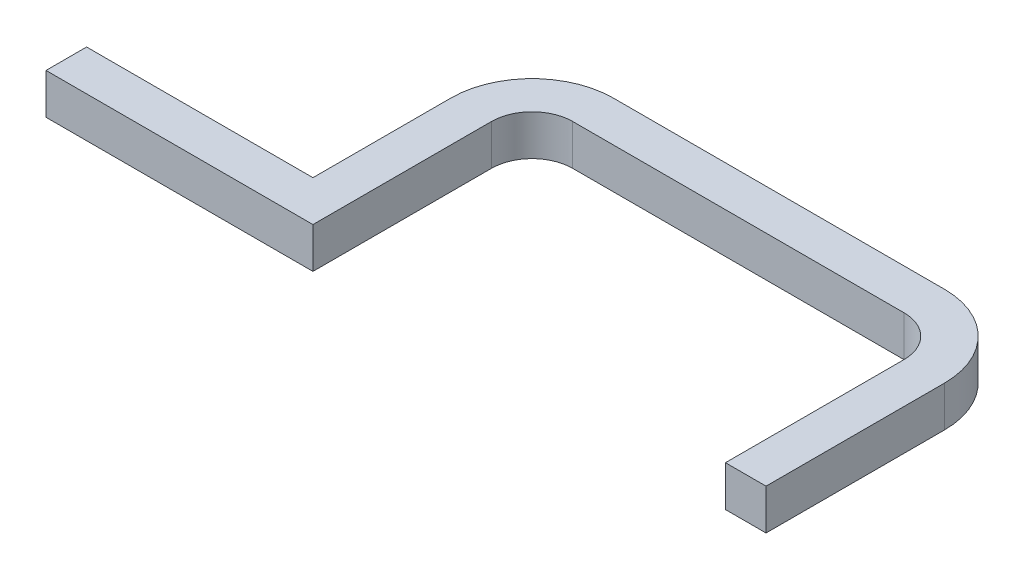
ISO-10303-21;
HEADER;
FILE_DESCRIPTION(('STEP AP214'),'2;1');
FILE_NAME('part.step','',(''),(''),'','','');
FILE_SCHEMA(('AUTOMOTIVE_DESIGN { 1 0 10303 214 1 1 1 1 }'));
ENDSEC;
DATA;
#1=APPLICATION_CONTEXT('core data for automotive mechanical design processes');
#2=APPLICATION_PROTOCOL_DEFINITION('international standard','automotive_design',2000,#1);
#3=PRODUCT_CONTEXT('',#1,'mechanical');
#4=PRODUCT('Part','Part','',(#3));
#5=PRODUCT_RELATED_PRODUCT_CATEGORY('part','',(#4));
#6=PRODUCT_DEFINITION_FORMATION('','',#4);
#7=PRODUCT_DEFINITION_CONTEXT('part definition',#1,'design');
#8=PRODUCT_DEFINITION('design','',#6,#7);
#9=PRODUCT_DEFINITION_SHAPE('','',#8);
#10=(LENGTH_UNIT() NAMED_UNIT(*) SI_UNIT(.MILLI.,.METRE.));
#11=(NAMED_UNIT(*) PLANE_ANGLE_UNIT() SI_UNIT($,.RADIAN.));
#12=(NAMED_UNIT(*) SI_UNIT($,.STERADIAN.) SOLID_ANGLE_UNIT());
#13=UNCERTAINTY_MEASURE_WITH_UNIT(LENGTH_MEASURE(1.E-05),#10,'distance_accuracy_value','');
#14=(GEOMETRIC_REPRESENTATION_CONTEXT(3) GLOBAL_UNCERTAINTY_ASSIGNED_CONTEXT((#13)) GLOBAL_UNIT_ASSIGNED_CONTEXT((#10,
#11,#12)) REPRESENTATION_CONTEXT('',''));
#15=CARTESIAN_POINT('',(0.,0.,0.));
#16=DIRECTION('',(0.,0.,1.));
#17=DIRECTION('',(1.,0.,0.));
#18=AXIS2_PLACEMENT_3D('',#15,#16,#17);
#19=CARTESIAN_POINT('',(0.,10.,0.));
#20=DIRECTION('',(0.,0.,-1.));
#21=DIRECTION('',(-1.,0.,0.));
#22=AXIS2_PLACEMENT_3D('',#19,#20,#21);
#23=PLANE('',#22);
#24=DIRECTION('',(1.,0.,0.));
#25=VECTOR('',#24,1.);
#26=CARTESIAN_POINT('',(0.,0.,0.));
#27=LINE('',#26,#25);
#28=CARTESIAN_POINT('',(-36.6007252870548,0.,0.));
#29=VERTEX_POINT('',#28);
#30=CARTESIAN_POINT('',(29.1495515678732,0.,0.));
#31=VERTEX_POINT('',#30);
#32=EDGE_CURVE('E101',#29,#31,#27,.T.);
#33=ORIENTED_EDGE('',*,*,#32,.T.);
#34=DIRECTION('',(0.,-1.,0.));
#35=VECTOR('',#34,1.);
#36=CARTESIAN_POINT('',(29.1495515678732,10.,0.));
#37=LINE('',#36,#35);
#38=CARTESIAN_POINT('',(29.1495515678732,10.,0.));
#39=VERTEX_POINT('',#38);
#40=EDGE_CURVE('E11',#39,#31,#37,.T.);
#41=ORIENTED_EDGE('',*,*,#40,.F.);
#42=DIRECTION('',(1.,0.,0.));
#43=VECTOR('',#42,1.);
#44=CARTESIAN_POINT('',(-36.6007252870548,10.,0.));
#45=LINE('',#44,#43);
#46=CARTESIAN_POINT('',(-36.6007252870548,10.,0.));
#47=VERTEX_POINT('',#46);
#48=EDGE_CURVE('E107',#47,#39,#45,.T.);
#49=ORIENTED_EDGE('',*,*,#48,.F.);
#50=DIRECTION('',(0.,-1.,0.));
#51=VECTOR('',#50,1.);
#52=CARTESIAN_POINT('',(-36.6007252870548,10.,0.));
#53=LINE('',#52,#51);
#54=EDGE_CURVE('E160',#47,#29,#53,.T.);
#55=ORIENTED_EDGE('',*,*,#54,.T.);
#56=EDGE_LOOP('',(#33,#41,#49,#55));
#57=FACE_BOUND('',#56,.T.);
#58=ADVANCED_FACE('F32',(#57),#23,.F.);
#59=CARTESIAN_POINT('',(29.1495515678732,10.,0.));
#60=DIRECTION('',(-1.,0.,0.));
#61=DIRECTION('',(0.,0.,1.));
#62=AXIS2_PLACEMENT_3D('',#59,#60,#61);
#63=PLANE('',#62);
#64=DIRECTION('',(0.,0.,-1.));
#65=VECTOR('',#64,1.);
#66=CARTESIAN_POINT('',(29.1495515678732,0.,0.));
#67=LINE('',#66,#65);
#68=CARTESIAN_POINT('',(29.1495515678732,0.,-43.9749999999999));
#69=VERTEX_POINT('',#68);
#70=EDGE_CURVE('E165',#31,#69,#67,.T.);
#71=ORIENTED_EDGE('',*,*,#70,.T.);
#72=DIRECTION('',(0.,-1.,0.));
#73=VECTOR('',#72,1.);
#74=CARTESIAN_POINT('',(29.1495515678732,10.,-43.9749999999999));
#75=LINE('',#74,#73);
#76=CARTESIAN_POINT('',(29.1495515678732,10.,-43.9749999999999));
#77=VERTEX_POINT('',#76);
#78=EDGE_CURVE('E40',#77,#69,#75,.T.);
#79=ORIENTED_EDGE('',*,*,#78,.F.);
#80=DIRECTION('',(0.,0.,-1.));
#81=VECTOR('',#80,1.);
#82=CARTESIAN_POINT('',(29.1495515678732,10.,0.));
#83=LINE('',#82,#81);
#84=EDGE_CURVE('E267',#39,#77,#83,.T.);
#85=ORIENTED_EDGE('',*,*,#84,.F.);
#86=ORIENTED_EDGE('',*,*,#40,.T.);
#87=EDGE_LOOP('',(#71,#79,#85,#86));
#88=FACE_BOUND('',#87,.T.);
#89=ADVANCED_FACE('F270',(#88),#63,.F.);
#90=CARTESIAN_POINT('',(39.1495515678732,10.,-43.975));
#91=DIRECTION('',(0.,-1.,0.));
#92=DIRECTION('',(0.,0.,-1.));
#93=AXIS2_PLACEMENT_3D('',#90,#91,#92);
#94=CYLINDRICAL_SURFACE('',#93,10.);
#95=CARTESIAN_POINT('',(39.1495515678732,0.,-43.975));
#96=DIRECTION('',(0.,-1.,0.));
#97=DIRECTION('',(0.,0.,-1.));
#98=AXIS2_PLACEMENT_3D('',#95,#96,#97);
#99=CIRCLE('',#98,10.);
#100=CARTESIAN_POINT('',(39.1495515678733,0.,-53.975));
#101=VERTEX_POINT('',#100);
#102=EDGE_CURVE('E167',#69,#101,#99,.T.);
#103=ORIENTED_EDGE('',*,*,#102,.T.);
#104=DIRECTION('',(0.,-1.,0.));
#105=VECTOR('',#104,1.);
#106=CARTESIAN_POINT('',(39.1495515678733,10.,-53.975));
#107=LINE('',#106,#105);
#108=CARTESIAN_POINT('',(39.1495515678733,10.,-53.975));
#109=VERTEX_POINT('',#108);
#110=EDGE_CURVE('E214',#109,#101,#107,.T.);
#111=ORIENTED_EDGE('',*,*,#110,.F.);
#112=CARTESIAN_POINT('',(39.1495515678732,10.,-43.975));
#113=DIRECTION('',(0.,-1.,0.));
#114=DIRECTION('',(0.,0.,-1.));
#115=AXIS2_PLACEMENT_3D('',#112,#113,#114);
#116=CIRCLE('',#115,10.);
#117=EDGE_CURVE('E223',#77,#109,#116,.T.);
#118=ORIENTED_EDGE('',*,*,#117,.F.);
#119=ORIENTED_EDGE('',*,*,#78,.T.);
#120=EDGE_LOOP('',(#103,#111,#118,#119));
#121=FACE_BOUND('',#120,.T.);
#122=ADVANCED_FACE('F221',(#121),#94,.F.);
#123=CARTESIAN_POINT('',(39.1495515678733,10.,-53.975));
#124=DIRECTION('',(0.,0.,-1.));
#125=DIRECTION('',(-1.,0.,0.));
#126=AXIS2_PLACEMENT_3D('',#123,#124,#125);
#127=PLANE('',#126);
#128=DIRECTION('',(1.,0.,0.));
#129=VECTOR('',#128,1.);
#130=CARTESIAN_POINT('',(39.1495515678733,0.,-53.975));
#131=LINE('',#130,#129);
#132=CARTESIAN_POINT('',(120.749551567873,0.,-53.975));
#133=VERTEX_POINT('',#132);
#134=EDGE_CURVE('E169',#101,#133,#131,.T.);
#135=ORIENTED_EDGE('',*,*,#134,.T.);
#136=DIRECTION('',(0.,-1.,0.));
#137=VECTOR('',#136,1.);
#138=CARTESIAN_POINT('',(120.749551567873,10.,-53.975));
#139=LINE('',#138,#137);
#140=CARTESIAN_POINT('',(120.749551567873,10.,-53.975));
#141=VERTEX_POINT('',#140);
#142=EDGE_CURVE('E211',#141,#133,#139,.T.);
#143=ORIENTED_EDGE('',*,*,#142,.F.);
#144=DIRECTION('',(1.,0.,0.));
#145=VECTOR('',#144,1.);
#146=CARTESIAN_POINT('',(39.1495515678733,10.,-53.975));
#147=LINE('',#146,#145);
#148=EDGE_CURVE('E241',#109,#141,#147,.T.);
#149=ORIENTED_EDGE('',*,*,#148,.F.);
#150=ORIENTED_EDGE('',*,*,#110,.T.);
#151=EDGE_LOOP('',(#135,#143,#149,#150));
#152=FACE_BOUND('',#151,.T.);
#153=ADVANCED_FACE('F232',(#152),#127,.F.);
#154=CARTESIAN_POINT('',(120.749551567873,10.,-43.975));
#155=DIRECTION('',(0.,-1.,0.));
#156=DIRECTION('',(0.,0.,-1.));
#157=AXIS2_PLACEMENT_3D('',#154,#155,#156);
#158=CYLINDRICAL_SURFACE('',#157,10.);
#159=CARTESIAN_POINT('',(120.749551567873,0.,-43.975));
#160=DIRECTION('',(0.,-1.,0.));
#161=DIRECTION('',(0.,0.,-1.));
#162=AXIS2_PLACEMENT_3D('',#159,#160,#161);
#163=CIRCLE('',#162,10.);
#164=CARTESIAN_POINT('',(130.749551567873,0.,-43.9749999999999));
#165=VERTEX_POINT('',#164);
#166=EDGE_CURVE('E171',#133,#165,#163,.T.);
#167=ORIENTED_EDGE('',*,*,#166,.T.);
#168=DIRECTION('',(0.,-1.,0.));
#169=VECTOR('',#168,1.);
#170=CARTESIAN_POINT('',(130.749551567873,10.,-43.9749999999999));
#171=LINE('',#170,#169);
#172=CARTESIAN_POINT('',(130.749551567873,10.,-43.9749999999999));
#173=VERTEX_POINT('',#172);
#174=EDGE_CURVE('E208',#173,#165,#171,.T.);
#175=ORIENTED_EDGE('',*,*,#174,.F.);
#176=CARTESIAN_POINT('',(120.749551567873,10.,-43.975));
#177=DIRECTION('',(0.,-1.,0.));
#178=DIRECTION('',(0.,0.,-1.));
#179=AXIS2_PLACEMENT_3D('',#176,#177,#178);
#180=CIRCLE('',#179,10.);
#181=EDGE_CURVE('E238',#141,#173,#180,.T.);
#182=ORIENTED_EDGE('',*,*,#181,.F.);
#183=ORIENTED_EDGE('',*,*,#142,.T.);
#184=EDGE_LOOP('',(#167,#175,#182,#183));
#185=FACE_BOUND('',#184,.T.);
#186=ADVANCED_FACE('F236',(#185),#158,.F.);
#187=CARTESIAN_POINT('',(130.749551567873,10.,-43.9749999999999));
#188=DIRECTION('',(1.,0.,0.));
#189=DIRECTION('',(0.,0.,-1.));
#190=AXIS2_PLACEMENT_3D('',#187,#188,#189);
#191=PLANE('',#190);
#192=DIRECTION('',(0.,0.,1.));
#193=VECTOR('',#192,1.);
#194=CARTESIAN_POINT('',(130.749551567873,0.,-43.9749999999999));
#195=LINE('',#194,#193);
#196=CARTESIAN_POINT('',(130.749551567873,0.,0.));
#197=VERTEX_POINT('',#196);
#198=EDGE_CURVE('E173',#165,#197,#195,.T.);
#199=ORIENTED_EDGE('',*,*,#198,.T.);
#200=DIRECTION('',(0.,-1.,0.));
#201=VECTOR('',#200,1.);
#202=CARTESIAN_POINT('',(130.749551567873,10.,0.));
#203=LINE('',#202,#201);
#204=CARTESIAN_POINT('',(130.749551567873,10.,0.));
#205=VERTEX_POINT('',#204);
#206=EDGE_CURVE('E205',#205,#197,#203,.T.);
#207=ORIENTED_EDGE('',*,*,#206,.F.);
#208=DIRECTION('',(0.,0.,1.));
#209=VECTOR('',#208,1.);
#210=CARTESIAN_POINT('',(130.749551567873,10.,-43.9749999999999));
#211=LINE('',#210,#209);
#212=EDGE_CURVE('E240',#173,#205,#211,.T.);
#213=ORIENTED_EDGE('',*,*,#212,.F.);
#214=ORIENTED_EDGE('',*,*,#174,.T.);
#215=EDGE_LOOP('',(#199,#207,#213,#214));
#216=FACE_BOUND('',#215,.T.);
#217=ADVANCED_FACE('F282',(#216),#191,.F.);
#218=CARTESIAN_POINT('',(130.749551567873,10.,0.));
#219=DIRECTION('',(0.,0.,-1.));
#220=DIRECTION('',(-1.,0.,0.));
#221=AXIS2_PLACEMENT_3D('',#218,#219,#220);
#222=PLANE('',#221);
#223=DIRECTION('',(1.,0.,0.));
#224=VECTOR('',#223,1.);
#225=CARTESIAN_POINT('',(130.749551567873,0.,0.));
#226=LINE('',#225,#224);
#227=CARTESIAN_POINT('',(140.749551567873,0.,0.));
#228=VERTEX_POINT('',#227);
#229=EDGE_CURVE('E175',#197,#228,#226,.T.);
#230=ORIENTED_EDGE('',*,*,#229,.T.);
#231=DIRECTION('',(0.,-1.,0.));
#232=VECTOR('',#231,1.);
#233=CARTESIAN_POINT('',(140.749551567873,10.,0.));
#234=LINE('',#233,#232);
#235=CARTESIAN_POINT('',(140.749551567873,10.,0.));
#236=VERTEX_POINT('',#235);
#237=EDGE_CURVE('E202',#236,#228,#234,.T.);
#238=ORIENTED_EDGE('',*,*,#237,.F.);
#239=DIRECTION('',(1.,0.,0.));
#240=VECTOR('',#239,1.);
#241=CARTESIAN_POINT('',(130.749551567873,10.,0.));
#242=LINE('',#241,#240);
#243=EDGE_CURVE('E243',#205,#236,#242,.T.);
#244=ORIENTED_EDGE('',*,*,#243,.F.);
#245=ORIENTED_EDGE('',*,*,#206,.T.);
#246=EDGE_LOOP('',(#230,#238,#244,#245));
#247=FACE_BOUND('',#246,.T.);
#248=ADVANCED_FACE('F285',(#247),#222,.F.);
#249=CARTESIAN_POINT('',(140.749551567873,10.,-43.9749999999999));
#250=DIRECTION('',(-1.,0.,0.));
#251=DIRECTION('',(0.,0.,1.));
#252=AXIS2_PLACEMENT_3D('',#249,#250,#251);
#253=PLANE('',#252);
#254=DIRECTION('',(0.,0.,-1.));
#255=VECTOR('',#254,1.);
#256=CARTESIAN_POINT('',(140.749551567873,0.,-43.9749999999999));
#257=LINE('',#256,#255);
#258=CARTESIAN_POINT('',(140.749551567873,0.,-43.9749999999999));
#259=VERTEX_POINT('',#258);
#260=EDGE_CURVE('E177',#228,#259,#257,.T.);
#261=ORIENTED_EDGE('',*,*,#260,.T.);
#262=DIRECTION('',(0.,-1.,0.));
#263=VECTOR('',#262,1.);
#264=CARTESIAN_POINT('',(140.749551567873,10.,-43.9749999999999));
#265=LINE('',#264,#263);
#266=CARTESIAN_POINT('',(140.749551567873,10.,-43.9749999999999));
#267=VERTEX_POINT('',#266);
#268=EDGE_CURVE('E199',#267,#259,#265,.T.);
#269=ORIENTED_EDGE('',*,*,#268,.F.);
#270=DIRECTION('',(0.,0.,-1.));
#271=VECTOR('',#270,1.);
#272=CARTESIAN_POINT('',(140.749551567873,10.,-43.9749999999999));
#273=LINE('',#272,#271);
#274=EDGE_CURVE('E249',#236,#267,#273,.T.);
#275=ORIENTED_EDGE('',*,*,#274,.F.);
#276=ORIENTED_EDGE('',*,*,#237,.T.);
#277=EDGE_LOOP('',(#261,#269,#275,#276));
#278=FACE_BOUND('',#277,.T.);
#279=ADVANCED_FACE('F289',(#278),#253,.F.);
#280=CARTESIAN_POINT('',(120.749551567873,10.,-43.975));
#281=DIRECTION('',(0.,-1.,0.));
#282=DIRECTION('',(0.,0.,-1.));
#283=AXIS2_PLACEMENT_3D('',#280,#281,#282);
#284=CYLINDRICAL_SURFACE('',#283,20.);
#285=CARTESIAN_POINT('',(120.749551567873,0.,-43.975));
#286=DIRECTION('',(0.,1.,0.));
#287=DIRECTION('',(0.,0.,-1.));
#288=AXIS2_PLACEMENT_3D('',#285,#286,#287);
#289=CIRCLE('',#288,20.);
#290=CARTESIAN_POINT('',(120.749551567873,0.,-63.975));
#291=VERTEX_POINT('',#290);
#292=EDGE_CURVE('E179',#259,#291,#289,.T.);
#293=ORIENTED_EDGE('',*,*,#292,.T.);
#294=DIRECTION('',(0.,-1.,0.));
#295=VECTOR('',#294,1.);
#296=CARTESIAN_POINT('',(120.749551567873,10.,-63.975));
#297=LINE('',#296,#295);
#298=CARTESIAN_POINT('',(120.749551567873,10.,-63.975));
#299=VERTEX_POINT('',#298);
#300=EDGE_CURVE('E196',#299,#291,#297,.T.);
#301=ORIENTED_EDGE('',*,*,#300,.F.);
#302=CARTESIAN_POINT('',(120.749551567873,10.,-43.975));
#303=DIRECTION('',(0.,1.,0.));
#304=DIRECTION('',(0.,0.,-1.));
#305=AXIS2_PLACEMENT_3D('',#302,#303,#304);
#306=CIRCLE('',#305,20.);
#307=EDGE_CURVE('E251',#267,#299,#306,.T.);
#308=ORIENTED_EDGE('',*,*,#307,.F.);
#309=ORIENTED_EDGE('',*,*,#268,.T.);
#310=EDGE_LOOP('',(#293,#301,#308,#309));
#311=FACE_BOUND('',#310,.T.);
#312=ADVANCED_FACE('F293',(#311),#284,.T.);
#313=CARTESIAN_POINT('',(39.1495515678733,10.,-63.975));
#314=DIRECTION('',(0.,0.,1.));
#315=DIRECTION('',(1.,0.,0.));
#316=AXIS2_PLACEMENT_3D('',#313,#314,#315);
#317=PLANE('',#316);
#318=DIRECTION('',(-1.,0.,0.));
#319=VECTOR('',#318,1.);
#320=CARTESIAN_POINT('',(39.1495515678733,0.,-63.975));
#321=LINE('',#320,#319);
#322=CARTESIAN_POINT('',(39.1495515678733,0.,-63.975));
#323=VERTEX_POINT('',#322);
#324=EDGE_CURVE('E181',#291,#323,#321,.T.);
#325=ORIENTED_EDGE('',*,*,#324,.T.);
#326=DIRECTION('',(0.,-1.,0.));
#327=VECTOR('',#326,1.);
#328=CARTESIAN_POINT('',(39.1495515678733,10.,-63.975));
#329=LINE('',#328,#327);
#330=CARTESIAN_POINT('',(39.1495515678733,10.,-63.975));
#331=VERTEX_POINT('',#330);
#332=EDGE_CURVE('E193',#331,#323,#329,.T.);
#333=ORIENTED_EDGE('',*,*,#332,.F.);
#334=DIRECTION('',(-1.,0.,0.));
#335=VECTOR('',#334,1.);
#336=CARTESIAN_POINT('',(39.1495515678733,10.,-63.975));
#337=LINE('',#336,#335);
#338=EDGE_CURVE('E253',#299,#331,#337,.T.);
#339=ORIENTED_EDGE('',*,*,#338,.F.);
#340=ORIENTED_EDGE('',*,*,#300,.T.);
#341=EDGE_LOOP('',(#325,#333,#339,#340));
#342=FACE_BOUND('',#341,.T.);
#343=ADVANCED_FACE('F259',(#342),#317,.F.);
#344=CARTESIAN_POINT('',(39.1495515678732,10.,-43.975));
#345=DIRECTION('',(0.,-1.,0.));
#346=DIRECTION('',(0.,0.,-1.));
#347=AXIS2_PLACEMENT_3D('',#344,#345,#346);
#348=CYLINDRICAL_SURFACE('',#347,20.);
#349=CARTESIAN_POINT('',(39.1495515678732,0.,-43.975));
#350=DIRECTION('',(0.,1.,0.));
#351=DIRECTION('',(0.,0.,-1.));
#352=AXIS2_PLACEMENT_3D('',#349,#350,#351);
#353=CIRCLE('',#352,20.);
#354=CARTESIAN_POINT('',(19.1495515678732,0.,-43.9749999999999));
#355=VERTEX_POINT('',#354);
#356=EDGE_CURVE('E183',#323,#355,#353,.T.);
#357=ORIENTED_EDGE('',*,*,#356,.T.);
#358=DIRECTION('',(0.,-1.,0.));
#359=VECTOR('',#358,1.);
#360=CARTESIAN_POINT('',(19.1495515678732,10.,-43.9749999999999));
#361=LINE('',#360,#359);
#362=CARTESIAN_POINT('',(19.1495515678732,10.,-43.9749999999999));
#363=VERTEX_POINT('',#362);
#364=EDGE_CURVE('E155',#363,#355,#361,.T.);
#365=ORIENTED_EDGE('',*,*,#364,.F.);
#366=CARTESIAN_POINT('',(39.1495515678732,10.,-43.975));
#367=DIRECTION('',(0.,1.,0.));
#368=DIRECTION('',(0.,0.,-1.));
#369=AXIS2_PLACEMENT_3D('',#366,#367,#368);
#370=CIRCLE('',#369,20.);
#371=EDGE_CURVE('E145',#331,#363,#370,.T.);
#372=ORIENTED_EDGE('',*,*,#371,.F.);
#373=ORIENTED_EDGE('',*,*,#332,.T.);
#374=EDGE_LOOP('',(#357,#365,#372,#373));
#375=FACE_BOUND('',#374,.T.);
#376=ADVANCED_FACE('F263',(#375),#348,.T.);
#377=CARTESIAN_POINT('',(19.1495515678732,10.,-10.));
#378=DIRECTION('',(1.,0.,0.));
#379=DIRECTION('',(0.,0.,-1.));
#380=AXIS2_PLACEMENT_3D('',#377,#378,#379);
#381=PLANE('',#380);
#382=DIRECTION('',(0.,0.,1.));
#383=VECTOR('',#382,1.);
#384=CARTESIAN_POINT('',(19.1495515678732,0.,-10.));
#385=LINE('',#384,#383);
#386=CARTESIAN_POINT('',(19.1495515678732,0.,-10.));
#387=VERTEX_POINT('',#386);
#388=EDGE_CURVE('E154',#355,#387,#385,.T.);
#389=ORIENTED_EDGE('',*,*,#388,.T.);
#390=DIRECTION('',(0.,-1.,0.));
#391=VECTOR('',#390,1.);
#392=CARTESIAN_POINT('',(19.1495515678732,10.,-10.));
#393=LINE('',#392,#391);
#394=CARTESIAN_POINT('',(19.1495515678732,10.,-10.));
#395=VERTEX_POINT('',#394);
#396=EDGE_CURVE('E151',#395,#387,#393,.T.);
#397=ORIENTED_EDGE('',*,*,#396,.F.);
#398=DIRECTION('',(0.,0.,1.));
#399=VECTOR('',#398,1.);
#400=CARTESIAN_POINT('',(19.1495515678732,10.,-10.));
#401=LINE('',#400,#399);
#402=EDGE_CURVE('E139',#363,#395,#401,.T.);
#403=ORIENTED_EDGE('',*,*,#402,.F.);
#404=ORIENTED_EDGE('',*,*,#364,.T.);
#405=EDGE_LOOP('',(#389,#397,#403,#404));
#406=FACE_BOUND('',#405,.T.);
#407=ADVANCED_FACE('F152',(#406),#381,.F.);
#408=CARTESIAN_POINT('',(0.,10.,-10.));
#409=DIRECTION('',(0.,0.,1.));
#410=DIRECTION('',(1.,0.,0.));
#411=AXIS2_PLACEMENT_3D('',#408,#409,#410);
#412=PLANE('',#411);
#413=DIRECTION('',(-1.,0.,0.));
#414=VECTOR('',#413,1.);
#415=CARTESIAN_POINT('',(0.,0.,-10.));
#416=LINE('',#415,#414);
#417=CARTESIAN_POINT('',(-36.6007252870548,0.,-10.));
#418=VERTEX_POINT('',#417);
#419=EDGE_CURVE('E94',#387,#418,#416,.T.);
#420=ORIENTED_EDGE('',*,*,#419,.T.);
#421=DIRECTION('',(0.,-1.,0.));
#422=VECTOR('',#421,1.);
#423=CARTESIAN_POINT('',(-36.6007252870548,10.,-10.));
#424=LINE('',#423,#422);
#425=CARTESIAN_POINT('',(-36.6007252870548,10.,-10.));
#426=VERTEX_POINT('',#425);
#427=EDGE_CURVE('E156',#426,#418,#424,.T.);
#428=ORIENTED_EDGE('',*,*,#427,.F.);
#429=DIRECTION('',(-1.,0.,0.));
#430=VECTOR('',#429,1.);
#431=CARTESIAN_POINT('',(0.,10.,-10.));
#432=LINE('',#431,#430);
#433=EDGE_CURVE('E143',#395,#426,#432,.T.);
#434=ORIENTED_EDGE('',*,*,#433,.F.);
#435=ORIENTED_EDGE('',*,*,#396,.T.);
#436=EDGE_LOOP('',(#420,#428,#434,#435));
#437=FACE_BOUND('',#436,.T.);
#438=ADVANCED_FACE('F158',(#437),#412,.F.);
#439=CARTESIAN_POINT('',(-36.6007252870548,10.,-10.));
#440=DIRECTION('',(1.,0.,0.));
#441=DIRECTION('',(0.,0.,-1.));
#442=AXIS2_PLACEMENT_3D('',#439,#440,#441);
#443=PLANE('',#442);
#444=DIRECTION('',(0.,0.,1.));
#445=VECTOR('',#444,1.);
#446=CARTESIAN_POINT('',(-36.6007252870548,0.,-10.));
#447=LINE('',#446,#445);
#448=EDGE_CURVE('E187',#418,#29,#447,.T.);
#449=ORIENTED_EDGE('',*,*,#448,.T.);
#450=ORIENTED_EDGE('',*,*,#54,.F.);
#451=DIRECTION('',(0.,0.,1.));
#452=VECTOR('',#451,1.);
#453=CARTESIAN_POINT('',(-36.6007252870548,10.,-10.));
#454=LINE('',#453,#452);
#455=EDGE_CURVE('E48',#426,#47,#454,.T.);
#456=ORIENTED_EDGE('',*,*,#455,.F.);
#457=ORIENTED_EDGE('',*,*,#427,.T.);
#458=EDGE_LOOP('',(#449,#450,#456,#457));
#459=FACE_BOUND('',#458,.T.);
#460=ADVANCED_FACE('F265',(#459),#443,.F.);
#461=CARTESIAN_POINT('',(39.1495515678732,10.,-43.975));
#462=DIRECTION('',(0.,-1.,0.));
#463=DIRECTION('',(0.,0.,-1.));
#464=AXIS2_PLACEMENT_3D('',#461,#462,#463);
#465=PLANE('',#464);
#466=ORIENTED_EDGE('',*,*,#48,.T.);
#467=ORIENTED_EDGE('',*,*,#84,.T.);
#468=ORIENTED_EDGE('',*,*,#117,.T.);
#469=ORIENTED_EDGE('',*,*,#148,.T.);
#470=ORIENTED_EDGE('',*,*,#181,.T.);
#471=ORIENTED_EDGE('',*,*,#212,.T.);
#472=ORIENTED_EDGE('',*,*,#243,.T.);
#473=ORIENTED_EDGE('',*,*,#274,.T.);
#474=ORIENTED_EDGE('',*,*,#307,.T.);
#475=ORIENTED_EDGE('',*,*,#338,.T.);
#476=ORIENTED_EDGE('',*,*,#371,.T.);
#477=ORIENTED_EDGE('',*,*,#402,.T.);
#478=ORIENTED_EDGE('',*,*,#433,.T.);
#479=ORIENTED_EDGE('',*,*,#455,.T.);
#480=EDGE_LOOP('',(#466,#467,#468,#469,#470,#471,#472,#473,#474,#475,#476,#477,#478,#479));
#481=FACE_BOUND('',#480,.T.);
#482=ADVANCED_FACE('F141',(#481),#465,.F.);
#483=CARTESIAN_POINT('',(39.1495515678732,0.,-43.975));
#484=DIRECTION('',(0.,-1.,0.));
#485=DIRECTION('',(0.,0.,-1.));
#486=AXIS2_PLACEMENT_3D('',#483,#484,#485);
#487=PLANE('',#486);
#488=ORIENTED_EDGE('',*,*,#32,.F.);
#489=ORIENTED_EDGE('',*,*,#448,.F.);
#490=ORIENTED_EDGE('',*,*,#419,.F.);
#491=ORIENTED_EDGE('',*,*,#388,.F.);
#492=ORIENTED_EDGE('',*,*,#356,.F.);
#493=ORIENTED_EDGE('',*,*,#324,.F.);
#494=ORIENTED_EDGE('',*,*,#292,.F.);
#495=ORIENTED_EDGE('',*,*,#260,.F.);
#496=ORIENTED_EDGE('',*,*,#229,.F.);
#497=ORIENTED_EDGE('',*,*,#198,.F.);
#498=ORIENTED_EDGE('',*,*,#166,.F.);
#499=ORIENTED_EDGE('',*,*,#134,.F.);
#500=ORIENTED_EDGE('',*,*,#102,.F.);
#501=ORIENTED_EDGE('',*,*,#70,.F.);
#502=EDGE_LOOP('',(#488,#489,#490,#491,#492,#493,#494,#495,#496,#497,#498,#499,#500,#501));
#503=FACE_BOUND('',#502,.T.);
#504=ADVANCED_FACE('F227',(#503),#487,.T.);
#505=CLOSED_SHELL('',(#58,#89,#122,#153,#186,#217,#248,#279,#312,#343,#376,#407,#438,#460,#482,#504));
#506=MANIFOLD_SOLID_BREP('B2',#505);
#507=ADVANCED_BREP_SHAPE_REPRESENTATION('',(#18,#506),#14);
#508=SHAPE_DEFINITION_REPRESENTATION(#9,#507);
ENDSEC;
END-ISO-10303-21;
